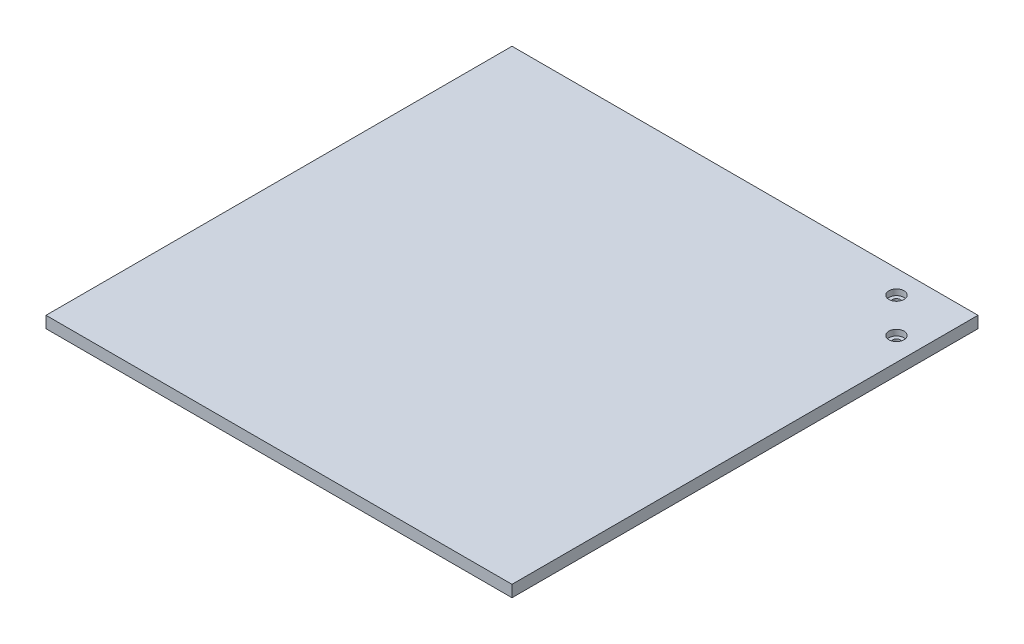
ISO-10303-21;
HEADER;
FILE_DESCRIPTION(('STEP AP214'),'2;1');
FILE_NAME('part.step','',(''),(''),'','','');
FILE_SCHEMA(('AUTOMOTIVE_DESIGN { 1 0 10303 214 1 1 1 1 }'));
ENDSEC;
DATA;
#1=APPLICATION_CONTEXT('core data for automotive mechanical design processes');
#2=APPLICATION_PROTOCOL_DEFINITION('international standard','automotive_design',2000,#1);
#3=PRODUCT_CONTEXT('',#1,'mechanical');
#4=PRODUCT('Part','Part','',(#3));
#5=PRODUCT_RELATED_PRODUCT_CATEGORY('part','',(#4));
#6=PRODUCT_DEFINITION_FORMATION('','',#4);
#7=PRODUCT_DEFINITION_CONTEXT('part definition',#1,'design');
#8=PRODUCT_DEFINITION('design','',#6,#7);
#9=PRODUCT_DEFINITION_SHAPE('','',#8);
#10=(LENGTH_UNIT() NAMED_UNIT(*) SI_UNIT(.MILLI.,.METRE.));
#11=(NAMED_UNIT(*) PLANE_ANGLE_UNIT() SI_UNIT($,.RADIAN.));
#12=(NAMED_UNIT(*) SI_UNIT($,.STERADIAN.) SOLID_ANGLE_UNIT());
#13=UNCERTAINTY_MEASURE_WITH_UNIT(LENGTH_MEASURE(1.E-05),#10,'distance_accuracy_value','');
#14=(GEOMETRIC_REPRESENTATION_CONTEXT(3) GLOBAL_UNCERTAINTY_ASSIGNED_CONTEXT((#13)) GLOBAL_UNIT_ASSIGNED_CONTEXT((#10,
#11,#12)) REPRESENTATION_CONTEXT('',''));
#15=CARTESIAN_POINT('',(0.,0.,0.));
#16=DIRECTION('',(0.,0.,1.));
#17=DIRECTION('',(1.,0.,0.));
#18=AXIS2_PLACEMENT_3D('',#15,#16,#17);
#19=CARTESIAN_POINT('',(100.,5.,100.));
#20=DIRECTION('',(-1.,0.,0.));
#21=DIRECTION('',(0.,0.,1.));
#22=AXIS2_PLACEMENT_3D('',#19,#20,#21);
#23=PLANE('',#22);
#24=DIRECTION('',(0.,0.,-1.));
#25=VECTOR('',#24,1.);
#26=CARTESIAN_POINT('',(100.,0.,100.));
#27=LINE('',#26,#25);
#28=CARTESIAN_POINT('',(100.,0.,100.));
#29=VERTEX_POINT('',#28);
#30=CARTESIAN_POINT('',(100.,0.,-100.));
#31=VERTEX_POINT('',#30);
#32=EDGE_CURVE('E112',#29,#31,#27,.T.);
#33=ORIENTED_EDGE('',*,*,#32,.T.);
#34=DIRECTION('',(0.,-1.,0.));
#35=VECTOR('',#34,1.);
#36=CARTESIAN_POINT('',(100.,5.,-100.));
#37=LINE('',#36,#35);
#38=CARTESIAN_POINT('',(100.,5.,-100.));
#39=VERTEX_POINT('',#38);
#40=EDGE_CURVE('E11',#39,#31,#37,.T.);
#41=ORIENTED_EDGE('',*,*,#40,.F.);
#42=DIRECTION('',(0.,0.,-1.));
#43=VECTOR('',#42,1.);
#44=CARTESIAN_POINT('',(100.,5.,100.));
#45=LINE('',#44,#43);
#46=CARTESIAN_POINT('',(100.,5.,100.));
#47=VERTEX_POINT('',#46);
#48=EDGE_CURVE('E96',#47,#39,#45,.T.);
#49=ORIENTED_EDGE('',*,*,#48,.F.);
#50=DIRECTION('',(0.,-1.,0.));
#51=VECTOR('',#50,1.);
#52=CARTESIAN_POINT('',(100.,5.,100.));
#53=LINE('',#52,#51);
#54=EDGE_CURVE('E108',#47,#29,#53,.T.);
#55=ORIENTED_EDGE('',*,*,#54,.T.);
#56=EDGE_LOOP('',(#33,#41,#49,#55));
#57=FACE_BOUND('',#56,.T.);
#58=ADVANCED_FACE('F44',(#57),#23,.F.);
#59=CARTESIAN_POINT('',(-100.,5.,-100.));
#60=DIRECTION('',(0.,0.,1.));
#61=DIRECTION('',(1.,0.,0.));
#62=AXIS2_PLACEMENT_3D('',#59,#60,#61);
#63=PLANE('',#62);
#64=DIRECTION('',(-1.,0.,0.));
#65=VECTOR('',#64,1.);
#66=CARTESIAN_POINT('',(-100.,0.,-100.));
#67=LINE('',#66,#65);
#68=CARTESIAN_POINT('',(-100.,0.,-100.));
#69=VERTEX_POINT('',#68);
#70=EDGE_CURVE('E101',#31,#69,#67,.T.);
#71=ORIENTED_EDGE('',*,*,#70,.T.);
#72=DIRECTION('',(0.,-1.,0.));
#73=VECTOR('',#72,1.);
#74=CARTESIAN_POINT('',(-100.,5.,-100.));
#75=LINE('',#74,#73);
#76=CARTESIAN_POINT('',(-100.,5.,-100.));
#77=VERTEX_POINT('',#76);
#78=EDGE_CURVE('E53',#77,#69,#75,.T.);
#79=ORIENTED_EDGE('',*,*,#78,.F.);
#80=DIRECTION('',(-1.,0.,0.));
#81=VECTOR('',#80,1.);
#82=CARTESIAN_POINT('',(-100.,5.,-100.));
#83=LINE('',#82,#81);
#84=EDGE_CURVE('E91',#39,#77,#83,.T.);
#85=ORIENTED_EDGE('',*,*,#84,.F.);
#86=ORIENTED_EDGE('',*,*,#40,.T.);
#87=EDGE_LOOP('',(#71,#79,#85,#86));
#88=FACE_BOUND('',#87,.T.);
#89=ADVANCED_FACE('F100',(#88),#63,.F.);
#90=CARTESIAN_POINT('',(-100.,5.,100.));
#91=DIRECTION('',(1.,0.,0.));
#92=DIRECTION('',(0.,0.,-1.));
#93=AXIS2_PLACEMENT_3D('',#90,#91,#92);
#94=PLANE('',#93);
#95=DIRECTION('',(0.,0.,1.));
#96=VECTOR('',#95,1.);
#97=CARTESIAN_POINT('',(-100.,0.,100.));
#98=LINE('',#97,#96);
#99=CARTESIAN_POINT('',(-100.,0.,100.));
#100=VERTEX_POINT('',#99);
#101=EDGE_CURVE('E78',#69,#100,#98,.T.);
#102=ORIENTED_EDGE('',*,*,#101,.T.);
#103=DIRECTION('',(0.,-1.,0.));
#104=VECTOR('',#103,1.);
#105=CARTESIAN_POINT('',(-100.,5.,100.));
#106=LINE('',#105,#104);
#107=CARTESIAN_POINT('',(-100.,5.,100.));
#108=VERTEX_POINT('',#107);
#109=EDGE_CURVE('E103',#108,#100,#106,.T.);
#110=ORIENTED_EDGE('',*,*,#109,.F.);
#111=DIRECTION('',(0.,0.,1.));
#112=VECTOR('',#111,1.);
#113=CARTESIAN_POINT('',(-100.,5.,100.));
#114=LINE('',#113,#112);
#115=EDGE_CURVE('E94',#77,#108,#114,.T.);
#116=ORIENTED_EDGE('',*,*,#115,.F.);
#117=ORIENTED_EDGE('',*,*,#78,.T.);
#118=EDGE_LOOP('',(#102,#110,#116,#117));
#119=FACE_BOUND('',#118,.T.);
#120=ADVANCED_FACE('F104',(#119),#94,.F.);
#121=CARTESIAN_POINT('',(-100.,5.,100.));
#122=DIRECTION('',(0.,0.,-1.));
#123=DIRECTION('',(-1.,0.,0.));
#124=AXIS2_PLACEMENT_3D('',#121,#122,#123);
#125=PLANE('',#124);
#126=DIRECTION('',(1.,0.,0.));
#127=VECTOR('',#126,1.);
#128=CARTESIAN_POINT('',(-100.,0.,100.));
#129=LINE('',#128,#127);
#130=EDGE_CURVE('E84',#100,#29,#129,.T.);
#131=ORIENTED_EDGE('',*,*,#130,.T.);
#132=ORIENTED_EDGE('',*,*,#54,.F.);
#133=DIRECTION('',(1.,0.,0.));
#134=VECTOR('',#133,1.);
#135=CARTESIAN_POINT('',(-100.,5.,100.));
#136=LINE('',#135,#134);
#137=EDGE_CURVE('E61',#108,#47,#136,.T.);
#138=ORIENTED_EDGE('',*,*,#137,.F.);
#139=ORIENTED_EDGE('',*,*,#109,.T.);
#140=EDGE_LOOP('',(#131,#132,#138,#139));
#141=FACE_BOUND('',#140,.T.);
#142=ADVANCED_FACE('F126',(#141),#125,.F.);
#143=CARTESIAN_POINT('',(0.,5.,0.));
#144=DIRECTION('',(0.,-1.,0.));
#145=DIRECTION('',(0.,0.,-1.));
#146=AXIS2_PLACEMENT_3D('',#143,#144,#145);
#147=PLANE('',#146);
#148=CARTESIAN_POINT('',(75.,5.,-90.));
#149=DIRECTION('',(0.,1.,0.));
#150=DIRECTION('',(0.,0.,1.));
#151=AXIS2_PLACEMENT_3D('',#148,#149,#150);
#152=CIRCLE('',#151,3.25);
#153=CARTESIAN_POINT('',(75.,5.,-86.75));
#154=VERTEX_POINT('',#153);
#155=EDGE_CURVE('E160',#154,#154,#152,.T.);
#156=ORIENTED_EDGE('',*,*,#155,.F.);
#157=EDGE_LOOP('',(#156));
#158=FACE_BOUND('',#157,.T.);
#159=CARTESIAN_POINT('',(90.,5.,-75.));
#160=DIRECTION('',(0.,1.,0.));
#161=DIRECTION('',(0.,0.,1.));
#162=AXIS2_PLACEMENT_3D('',#159,#160,#161);
#163=CIRCLE('',#162,3.25);
#164=CARTESIAN_POINT('',(90.,5.,-71.75));
#165=VERTEX_POINT('',#164);
#166=EDGE_CURVE('E144',#165,#165,#163,.T.);
#167=ORIENTED_EDGE('',*,*,#166,.F.);
#168=EDGE_LOOP('',(#167));
#169=FACE_BOUND('',#168,.T.);
#170=ORIENTED_EDGE('',*,*,#48,.T.);
#171=ORIENTED_EDGE('',*,*,#84,.T.);
#172=ORIENTED_EDGE('',*,*,#115,.T.);
#173=ORIENTED_EDGE('',*,*,#137,.T.);
#174=EDGE_LOOP('',(#170,#171,#172,#173));
#175=FACE_BOUND('',#174,.T.);
#176=ADVANCED_FACE('F92',(#158,#169,#175),#147,.F.);
#177=CARTESIAN_POINT('',(0.,0.,0.));
#178=DIRECTION('',(0.,-1.,0.));
#179=DIRECTION('',(0.,0.,-1.));
#180=AXIS2_PLACEMENT_3D('',#177,#178,#179);
#181=PLANE('',#180);
#182=CARTESIAN_POINT('',(75.,0.,-90.));
#183=DIRECTION('',(0.,-1.,0.));
#184=DIRECTION('',(0.,0.,-1.));
#185=AXIS2_PLACEMENT_3D('',#182,#183,#184);
#186=CIRCLE('',#185,1.7);
#187=CARTESIAN_POINT('',(75.,0.,-91.7));
#188=VERTEX_POINT('',#187);
#189=EDGE_CURVE('E148',#188,#188,#186,.T.);
#190=ORIENTED_EDGE('',*,*,#189,.F.);
#191=EDGE_LOOP('',(#190));
#192=FACE_BOUND('',#191,.T.);
#193=CARTESIAN_POINT('',(90.,0.,-75.));
#194=DIRECTION('',(0.,-1.,0.));
#195=DIRECTION('',(0.,0.,-1.));
#196=AXIS2_PLACEMENT_3D('',#193,#194,#195);
#197=CIRCLE('',#196,1.7);
#198=CARTESIAN_POINT('',(90.,0.,-76.7));
#199=VERTEX_POINT('',#198);
#200=EDGE_CURVE('E116',#199,#199,#197,.T.);
#201=ORIENTED_EDGE('',*,*,#200,.F.);
#202=EDGE_LOOP('',(#201));
#203=FACE_BOUND('',#202,.T.);
#204=ORIENTED_EDGE('',*,*,#32,.F.);
#205=ORIENTED_EDGE('',*,*,#130,.F.);
#206=ORIENTED_EDGE('',*,*,#101,.F.);
#207=ORIENTED_EDGE('',*,*,#70,.F.);
#208=EDGE_LOOP('',(#204,#205,#206,#207));
#209=FACE_BOUND('',#208,.T.);
#210=ADVANCED_FACE('F129',(#192,#203,#209),#181,.T.);
#211=CARTESIAN_POINT('',(90.,5.,-75.));
#212=DIRECTION('',(0.,1.,0.));
#213=DIRECTION('',(0.,0.,1.));
#214=AXIS2_PLACEMENT_3D('',#211,#212,#213);
#215=CYLINDRICAL_SURFACE('',#214,1.7);
#216=CARTESIAN_POINT('',(90.,2.5,-75.));
#217=DIRECTION('',(0.,1.,0.));
#218=DIRECTION('',(0.,0.,1.));
#219=AXIS2_PLACEMENT_3D('',#216,#217,#218);
#220=CIRCLE('',#219,1.70000000000001);
#221=CARTESIAN_POINT('',(90.,2.5,-73.3));
#222=VERTEX_POINT('',#221);
#223=EDGE_CURVE('E136',#222,#222,#220,.T.);
#224=ORIENTED_EDGE('',*,*,#223,.T.);
#225=EDGE_LOOP('',(#224));
#226=FACE_BOUND('',#225,.T.);
#227=ORIENTED_EDGE('',*,*,#200,.T.);
#228=EDGE_LOOP('',(#227));
#229=FACE_BOUND('',#228,.T.);
#230=ADVANCED_FACE('F185',(#226,#229),#215,.F.);
#231=CARTESIAN_POINT('',(91.7,2.5,-75.));
#232=DIRECTION('',(0.,-1.,0.));
#233=DIRECTION('',(0.,0.,-1.));
#234=AXIS2_PLACEMENT_3D('',#231,#232,#233);
#235=PLANE('',#234);
#236=ORIENTED_EDGE('',*,*,#223,.F.);
#237=EDGE_LOOP('',(#236));
#238=FACE_BOUND('',#237,.T.);
#239=CARTESIAN_POINT('',(90.,2.5,-75.));
#240=DIRECTION('',(0.,1.,0.));
#241=DIRECTION('',(0.,0.,1.));
#242=AXIS2_PLACEMENT_3D('',#239,#240,#241);
#243=CIRCLE('',#242,3.25);
#244=CARTESIAN_POINT('',(90.,2.5,-71.75));
#245=VERTEX_POINT('',#244);
#246=EDGE_CURVE('E140',#245,#245,#243,.T.);
#247=ORIENTED_EDGE('',*,*,#246,.T.);
#248=EDGE_LOOP('',(#247));
#249=FACE_BOUND('',#248,.T.);
#250=ADVANCED_FACE('F175',(#238,#249),#235,.F.);
#251=CARTESIAN_POINT('',(90.,5.,-75.));
#252=DIRECTION('',(0.,1.,0.));
#253=DIRECTION('',(0.,0.,1.));
#254=AXIS2_PLACEMENT_3D('',#251,#252,#253);
#255=CYLINDRICAL_SURFACE('',#254,3.25);
#256=ORIENTED_EDGE('',*,*,#246,.F.);
#257=EDGE_LOOP('',(#256));
#258=FACE_BOUND('',#257,.T.);
#259=ORIENTED_EDGE('',*,*,#166,.T.);
#260=EDGE_LOOP('',(#259));
#261=FACE_BOUND('',#260,.T.);
#262=ADVANCED_FACE('F172',(#258,#261),#255,.F.);
#263=CARTESIAN_POINT('',(75.,5.,-90.));
#264=DIRECTION('',(0.,1.,0.));
#265=DIRECTION('',(0.,0.,1.));
#266=AXIS2_PLACEMENT_3D('',#263,#264,#265);
#267=CYLINDRICAL_SURFACE('',#266,1.7);
#268=CARTESIAN_POINT('',(75.,2.5,-90.));
#269=DIRECTION('',(0.,1.,0.));
#270=DIRECTION('',(0.,0.,1.));
#271=AXIS2_PLACEMENT_3D('',#268,#269,#270);
#272=CIRCLE('',#271,1.70000000000001);
#273=CARTESIAN_POINT('',(75.,2.5,-88.3));
#274=VERTEX_POINT('',#273);
#275=EDGE_CURVE('E152',#274,#274,#272,.T.);
#276=ORIENTED_EDGE('',*,*,#275,.T.);
#277=EDGE_LOOP('',(#276));
#278=FACE_BOUND('',#277,.T.);
#279=ORIENTED_EDGE('',*,*,#189,.T.);
#280=EDGE_LOOP('',(#279));
#281=FACE_BOUND('',#280,.T.);
#282=ADVANCED_FACE('F174',(#278,#281),#267,.F.);
#283=CARTESIAN_POINT('',(76.7,2.5,-90.));
#284=DIRECTION('',(0.,-1.,0.));
#285=DIRECTION('',(0.,0.,-1.));
#286=AXIS2_PLACEMENT_3D('',#283,#284,#285);
#287=PLANE('',#286);
#288=ORIENTED_EDGE('',*,*,#275,.F.);
#289=EDGE_LOOP('',(#288));
#290=FACE_BOUND('',#289,.T.);
#291=CARTESIAN_POINT('',(75.,2.5,-90.));
#292=DIRECTION('',(0.,1.,0.));
#293=DIRECTION('',(0.,0.,1.));
#294=AXIS2_PLACEMENT_3D('',#291,#292,#293);
#295=CIRCLE('',#294,3.25);
#296=CARTESIAN_POINT('',(75.,2.5,-86.75));
#297=VERTEX_POINT('',#296);
#298=EDGE_CURVE('E156',#297,#297,#295,.T.);
#299=ORIENTED_EDGE('',*,*,#298,.T.);
#300=EDGE_LOOP('',(#299));
#301=FACE_BOUND('',#300,.T.);
#302=ADVANCED_FACE('F182',(#290,#301),#287,.F.);
#303=CARTESIAN_POINT('',(75.,5.,-90.));
#304=DIRECTION('',(0.,1.,0.));
#305=DIRECTION('',(0.,0.,1.));
#306=AXIS2_PLACEMENT_3D('',#303,#304,#305);
#307=CYLINDRICAL_SURFACE('',#306,3.25);
#308=ORIENTED_EDGE('',*,*,#298,.F.);
#309=EDGE_LOOP('',(#308));
#310=FACE_BOUND('',#309,.T.);
#311=ORIENTED_EDGE('',*,*,#155,.T.);
#312=EDGE_LOOP('',(#311));
#313=FACE_BOUND('',#312,.T.);
#314=ADVANCED_FACE('F165',(#310,#313),#307,.F.);
#315=CLOSED_SHELL('',(#58,#89,#120,#142,#176,#210,#230,#250,#262,#282,#302,#314));
#316=MANIFOLD_SOLID_BREP('B2',#315);
#317=ADVANCED_BREP_SHAPE_REPRESENTATION('',(#18,#316),#14);
#318=SHAPE_DEFINITION_REPRESENTATION(#9,#317);
ENDSEC;
END-ISO-10303-21;
